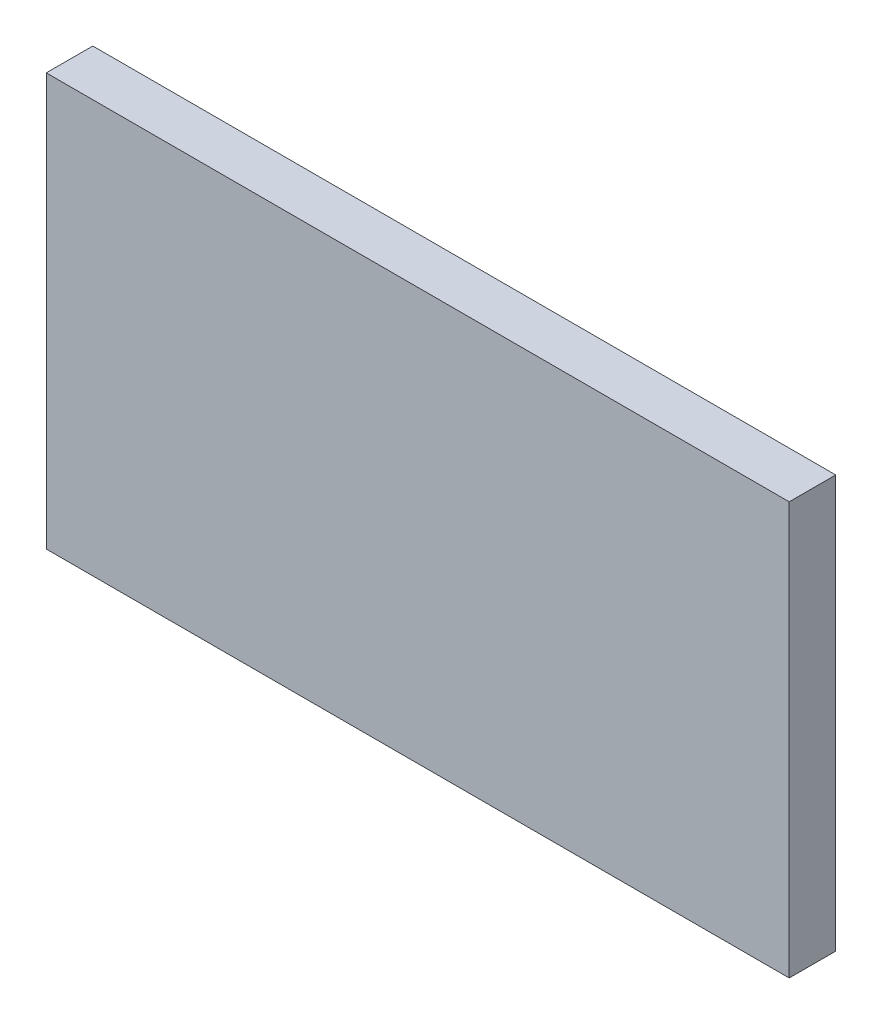
ISO-10303-21;
HEADER;
FILE_DESCRIPTION(('STEP AP214'),'2;1');
FILE_NAME('part.step','',(''),(''),'','','');
FILE_SCHEMA(('AUTOMOTIVE_DESIGN { 1 0 10303 214 1 1 1 1 }'));
ENDSEC;
DATA;
#1=APPLICATION_CONTEXT('core data for automotive mechanical design processes');
#2=APPLICATION_PROTOCOL_DEFINITION('international standard','automotive_design',2000,#1);
#3=PRODUCT_CONTEXT('',#1,'mechanical');
#4=PRODUCT('Part','Part','',(#3));
#5=PRODUCT_RELATED_PRODUCT_CATEGORY('part','',(#4));
#6=PRODUCT_DEFINITION_FORMATION('','',#4);
#7=PRODUCT_DEFINITION_CONTEXT('part definition',#1,'design');
#8=PRODUCT_DEFINITION('design','',#6,#7);
#9=PRODUCT_DEFINITION_SHAPE('','',#8);
#10=(LENGTH_UNIT() NAMED_UNIT(*) SI_UNIT(.MILLI.,.METRE.));
#11=(NAMED_UNIT(*) PLANE_ANGLE_UNIT() SI_UNIT($,.RADIAN.));
#12=(NAMED_UNIT(*) SI_UNIT($,.STERADIAN.) SOLID_ANGLE_UNIT());
#13=UNCERTAINTY_MEASURE_WITH_UNIT(LENGTH_MEASURE(1.E-05),#10,'distance_accuracy_value','');
#14=(GEOMETRIC_REPRESENTATION_CONTEXT(3) GLOBAL_UNCERTAINTY_ASSIGNED_CONTEXT((#13)) GLOBAL_UNIT_ASSIGNED_CONTEXT((#10,
#11,#12)) REPRESENTATION_CONTEXT('',''));
#15=CARTESIAN_POINT('',(0.,0.,0.));
#16=DIRECTION('',(0.,0.,1.));
#17=DIRECTION('',(1.,0.,0.));
#18=AXIS2_PLACEMENT_3D('',#15,#16,#17);
#19=CARTESIAN_POINT('',(11.98,6.65,1.5));
#20=DIRECTION('',(-1.,0.,0.));
#21=DIRECTION('',(0.,0.,1.));
#22=AXIS2_PLACEMENT_3D('',#19,#20,#21);
#23=PLANE('',#22);
#24=DIRECTION('',(0.,1.,0.));
#25=VECTOR('',#24,1.);
#26=CARTESIAN_POINT('',(11.98,6.65,0.));
#27=LINE('',#26,#25);
#28=CARTESIAN_POINT('',(11.98,-6.65,0.));
#29=VERTEX_POINT('',#28);
#30=CARTESIAN_POINT('',(11.98,6.65,0.));
#31=VERTEX_POINT('',#30);
#32=EDGE_CURVE('E95',#29,#31,#27,.T.);
#33=ORIENTED_EDGE('',*,*,#32,.T.);
#34=DIRECTION('',(0.,0.,-1.));
#35=VECTOR('',#34,1.);
#36=CARTESIAN_POINT('',(11.98,6.65,1.5));
#37=LINE('',#36,#35);
#38=CARTESIAN_POINT('',(11.98,6.65,1.5));
#39=VERTEX_POINT('',#38);
#40=EDGE_CURVE('E11',#39,#31,#37,.T.);
#41=ORIENTED_EDGE('',*,*,#40,.F.);
#42=DIRECTION('',(0.,1.,0.));
#43=VECTOR('',#42,1.);
#44=CARTESIAN_POINT('',(11.98,6.65,1.5));
#45=LINE('',#44,#43);
#46=CARTESIAN_POINT('',(11.98,-6.65,1.5));
#47=VERTEX_POINT('',#46);
#48=EDGE_CURVE('E83',#47,#39,#45,.T.);
#49=ORIENTED_EDGE('',*,*,#48,.F.);
#50=DIRECTION('',(0.,0.,-1.));
#51=VECTOR('',#50,1.);
#52=CARTESIAN_POINT('',(11.98,-6.65,1.5));
#53=LINE('',#52,#51);
#54=EDGE_CURVE('E91',#47,#29,#53,.T.);
#55=ORIENTED_EDGE('',*,*,#54,.T.);
#56=EDGE_LOOP('',(#33,#41,#49,#55));
#57=FACE_BOUND('',#56,.T.);
#58=ADVANCED_FACE('F32',(#57),#23,.F.);
#59=CARTESIAN_POINT('',(-11.98,6.65,1.5));
#60=DIRECTION('',(0.,-1.,0.));
#61=DIRECTION('',(0.,0.,-1.));
#62=AXIS2_PLACEMENT_3D('',#59,#60,#61);
#63=PLANE('',#62);
#64=DIRECTION('',(-1.,0.,0.));
#65=VECTOR('',#64,1.);
#66=CARTESIAN_POINT('',(-11.98,6.65,0.));
#67=LINE('',#66,#65);
#68=CARTESIAN_POINT('',(-11.98,6.65,0.));
#69=VERTEX_POINT('',#68);
#70=EDGE_CURVE('E87',#31,#69,#67,.T.);
#71=ORIENTED_EDGE('',*,*,#70,.T.);
#72=DIRECTION('',(0.,0.,-1.));
#73=VECTOR('',#72,1.);
#74=CARTESIAN_POINT('',(-11.98,6.65,1.5));
#75=LINE('',#74,#73);
#76=CARTESIAN_POINT('',(-11.98,6.65,1.5));
#77=VERTEX_POINT('',#76);
#78=EDGE_CURVE('E40',#77,#69,#75,.T.);
#79=ORIENTED_EDGE('',*,*,#78,.F.);
#80=DIRECTION('',(-1.,0.,0.));
#81=VECTOR('',#80,1.);
#82=CARTESIAN_POINT('',(-11.98,6.65,1.5));
#83=LINE('',#82,#81);
#84=EDGE_CURVE('E78',#39,#77,#83,.T.);
#85=ORIENTED_EDGE('',*,*,#84,.F.);
#86=ORIENTED_EDGE('',*,*,#40,.T.);
#87=EDGE_LOOP('',(#71,#79,#85,#86));
#88=FACE_BOUND('',#87,.T.);
#89=ADVANCED_FACE('F86',(#88),#63,.F.);
#90=CARTESIAN_POINT('',(-11.98,6.65,1.5));
#91=DIRECTION('',(1.,0.,0.));
#92=DIRECTION('',(0.,0.,-1.));
#93=AXIS2_PLACEMENT_3D('',#90,#91,#92);
#94=PLANE('',#93);
#95=DIRECTION('',(0.,-1.,0.));
#96=VECTOR('',#95,1.);
#97=CARTESIAN_POINT('',(-11.98,6.65,0.));
#98=LINE('',#97,#96);
#99=CARTESIAN_POINT('',(-11.98,-6.65,0.));
#100=VERTEX_POINT('',#99);
#101=EDGE_CURVE('E65',#69,#100,#98,.T.);
#102=ORIENTED_EDGE('',*,*,#101,.T.);
#103=DIRECTION('',(0.,0.,-1.));
#104=VECTOR('',#103,1.);
#105=CARTESIAN_POINT('',(-11.98,-6.65,1.5));
#106=LINE('',#105,#104);
#107=CARTESIAN_POINT('',(-11.98,-6.65,1.5));
#108=VERTEX_POINT('',#107);
#109=EDGE_CURVE('E88',#108,#100,#106,.T.);
#110=ORIENTED_EDGE('',*,*,#109,.F.);
#111=DIRECTION('',(0.,-1.,0.));
#112=VECTOR('',#111,1.);
#113=CARTESIAN_POINT('',(-11.98,6.65,1.5));
#114=LINE('',#113,#112);
#115=EDGE_CURVE('E81',#77,#108,#114,.T.);
#116=ORIENTED_EDGE('',*,*,#115,.F.);
#117=ORIENTED_EDGE('',*,*,#78,.T.);
#118=EDGE_LOOP('',(#102,#110,#116,#117));
#119=FACE_BOUND('',#118,.T.);
#120=ADVANCED_FACE('F89',(#119),#94,.F.);
#121=CARTESIAN_POINT('',(-11.98,-6.65,1.5));
#122=DIRECTION('',(0.,1.,0.));
#123=DIRECTION('',(0.,0.,1.));
#124=AXIS2_PLACEMENT_3D('',#121,#122,#123);
#125=PLANE('',#124);
#126=DIRECTION('',(1.,0.,0.));
#127=VECTOR('',#126,1.);
#128=CARTESIAN_POINT('',(-11.98,-6.65,0.));
#129=LINE('',#128,#127);
#130=EDGE_CURVE('E71',#100,#29,#129,.T.);
#131=ORIENTED_EDGE('',*,*,#130,.T.);
#132=ORIENTED_EDGE('',*,*,#54,.F.);
#133=DIRECTION('',(1.,0.,0.));
#134=VECTOR('',#133,1.);
#135=CARTESIAN_POINT('',(-11.98,-6.65,1.5));
#136=LINE('',#135,#134);
#137=EDGE_CURVE('E48',#108,#47,#136,.T.);
#138=ORIENTED_EDGE('',*,*,#137,.F.);
#139=ORIENTED_EDGE('',*,*,#109,.T.);
#140=EDGE_LOOP('',(#131,#132,#138,#139));
#141=FACE_BOUND('',#140,.T.);
#142=ADVANCED_FACE('F102',(#141),#125,.F.);
#143=CARTESIAN_POINT('',(0.,0.,1.5));
#144=DIRECTION('',(0.,0.,1.));
#145=DIRECTION('',(1.,0.,0.));
#146=AXIS2_PLACEMENT_3D('',#143,#144,#145);
#147=PLANE('',#146);
#148=ORIENTED_EDGE('',*,*,#48,.T.);
#149=ORIENTED_EDGE('',*,*,#84,.T.);
#150=ORIENTED_EDGE('',*,*,#115,.T.);
#151=ORIENTED_EDGE('',*,*,#137,.T.);
#152=EDGE_LOOP('',(#148,#149,#150,#151));
#153=FACE_BOUND('',#152,.T.);
#154=ADVANCED_FACE('F79',(#153),#147,.T.);
#155=CARTESIAN_POINT('',(0.,0.,0.));
#156=DIRECTION('',(0.,0.,1.));
#157=DIRECTION('',(1.,0.,0.));
#158=AXIS2_PLACEMENT_3D('',#155,#156,#157);
#159=PLANE('',#158);
#160=ORIENTED_EDGE('',*,*,#32,.F.);
#161=ORIENTED_EDGE('',*,*,#130,.F.);
#162=ORIENTED_EDGE('',*,*,#101,.F.);
#163=ORIENTED_EDGE('',*,*,#70,.F.);
#164=EDGE_LOOP('',(#160,#161,#162,#163));
#165=FACE_BOUND('',#164,.T.);
#166=ADVANCED_FACE('F105',(#165),#159,.F.);
#167=CLOSED_SHELL('',(#58,#89,#120,#142,#154,#166));
#168=MANIFOLD_SOLID_BREP('B2',#167);
#169=ADVANCED_BREP_SHAPE_REPRESENTATION('',(#18,#168),#14);
#170=SHAPE_DEFINITION_REPRESENTATION(#9,#169);
ENDSEC;
END-ISO-10303-21;
